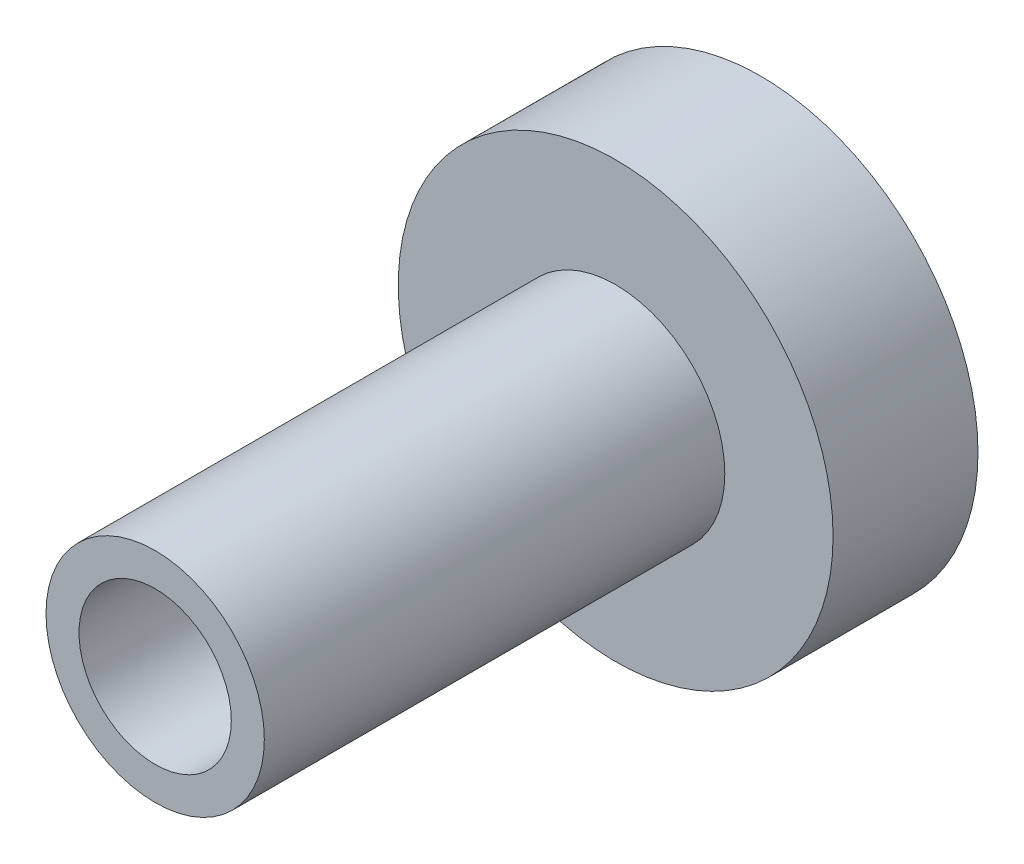
ISO-10303-21;
HEADER;
FILE_DESCRIPTION(('STEP AP214'),'2;1');
FILE_NAME('part.step','',(''),(''),'','','');
FILE_SCHEMA(('AUTOMOTIVE_DESIGN { 1 0 10303 214 1 1 1 1 }'));
ENDSEC;
DATA;
#1=APPLICATION_CONTEXT('core data for automotive mechanical design processes');
#2=APPLICATION_PROTOCOL_DEFINITION('international standard','automotive_design',2000,#1);
#3=PRODUCT_CONTEXT('',#1,'mechanical');
#4=PRODUCT('Part','Part','',(#3));
#5=PRODUCT_RELATED_PRODUCT_CATEGORY('part','',(#4));
#6=PRODUCT_DEFINITION_FORMATION('','',#4);
#7=PRODUCT_DEFINITION_CONTEXT('part definition',#1,'design');
#8=PRODUCT_DEFINITION('design','',#6,#7);
#9=PRODUCT_DEFINITION_SHAPE('','',#8);
#10=(LENGTH_UNIT() NAMED_UNIT(*) SI_UNIT(.MILLI.,.METRE.));
#11=(NAMED_UNIT(*) PLANE_ANGLE_UNIT() SI_UNIT($,.RADIAN.));
#12=(NAMED_UNIT(*) SI_UNIT($,.STERADIAN.) SOLID_ANGLE_UNIT());
#13=UNCERTAINTY_MEASURE_WITH_UNIT(LENGTH_MEASURE(1.E-05),#10,'distance_accuracy_value','');
#14=(GEOMETRIC_REPRESENTATION_CONTEXT(3) GLOBAL_UNCERTAINTY_ASSIGNED_CONTEXT((#13)) GLOBAL_UNIT_ASSIGNED_CONTEXT((#10,
#11,#12)) REPRESENTATION_CONTEXT('',''));
#15=CARTESIAN_POINT('',(0.,0.,0.));
#16=DIRECTION('',(0.,0.,1.));
#17=DIRECTION('',(1.,0.,0.));
#18=AXIS2_PLACEMENT_3D('',#15,#16,#17);
#19=CARTESIAN_POINT('',(0.,0.,33.));
#20=DIRECTION('',(0.,0.,1.));
#21=DIRECTION('',(1.,0.,0.));
#22=AXIS2_PLACEMENT_3D('',#19,#20,#21);
#23=PLANE('',#22);
#24=CARTESIAN_POINT('',(0.,0.,33.));
#25=DIRECTION('',(0.,0.,1.));
#26=DIRECTION('',(1.,0.,0.));
#27=AXIS2_PLACEMENT_3D('',#24,#25,#26);
#28=CIRCLE('',#27,4.15);
#29=CARTESIAN_POINT('',(4.15,0.,33.));
#30=VERTEX_POINT('',#29);
#31=EDGE_CURVE('E38',#30,#30,#28,.T.);
#32=ORIENTED_EDGE('',*,*,#31,.F.);
#33=EDGE_LOOP('',(#32));
#34=FACE_BOUND('',#33,.T.);
#35=CARTESIAN_POINT('',(0.,0.,33.));
#36=DIRECTION('',(0.,0.,1.));
#37=DIRECTION('',(1.,0.,0.));
#38=AXIS2_PLACEMENT_3D('',#35,#36,#37);
#39=CIRCLE('',#38,5.95);
#40=CARTESIAN_POINT('',(5.95,0.,33.));
#41=VERTEX_POINT('',#40);
#42=EDGE_CURVE('E52',#41,#41,#39,.T.);
#43=ORIENTED_EDGE('',*,*,#42,.T.);
#44=EDGE_LOOP('',(#43));
#45=FACE_BOUND('',#44,.T.);
#46=ADVANCED_FACE('F31',(#34,#45),#23,.T.);
#47=CARTESIAN_POINT('',(0.,0.,33.));
#48=DIRECTION('',(0.,0.,-1.));
#49=DIRECTION('',(-1.,0.,0.));
#50=AXIS2_PLACEMENT_3D('',#47,#48,#49);
#51=CYLINDRICAL_SURFACE('',#50,11.85);
#52=CARTESIAN_POINT('',(0.,0.,0.));
#53=DIRECTION('',(0.,0.,1.));
#54=DIRECTION('',(1.,0.,0.));
#55=AXIS2_PLACEMENT_3D('',#52,#53,#54);
#56=CIRCLE('',#55,11.85);
#57=CARTESIAN_POINT('',(11.85,0.,0.));
#58=VERTEX_POINT('',#57);
#59=EDGE_CURVE('E10',#58,#58,#56,.T.);
#60=ORIENTED_EDGE('',*,*,#59,.T.);
#61=EDGE_LOOP('',(#60));
#62=FACE_BOUND('',#61,.T.);
#63=CARTESIAN_POINT('',(0.,0.,7.9));
#64=DIRECTION('',(0.,0.,1.));
#65=DIRECTION('',(1.,0.,0.));
#66=AXIS2_PLACEMENT_3D('',#63,#64,#65);
#67=CIRCLE('',#66,11.85);
#68=CARTESIAN_POINT('',(11.85,0.,7.9));
#69=VERTEX_POINT('',#68);
#70=EDGE_CURVE('E47',#69,#69,#67,.T.);
#71=ORIENTED_EDGE('',*,*,#70,.F.);
#72=EDGE_LOOP('',(#71));
#73=FACE_BOUND('',#72,.T.);
#74=ADVANCED_FACE('F33',(#62,#73),#51,.T.);
#75=CARTESIAN_POINT('',(0.,0.,0.));
#76=DIRECTION('',(0.,0.,1.));
#77=DIRECTION('',(1.,0.,0.));
#78=AXIS2_PLACEMENT_3D('',#75,#76,#77);
#79=PLANE('',#78);
#80=ORIENTED_EDGE('',*,*,#59,.F.);
#81=EDGE_LOOP('',(#80));
#82=FACE_BOUND('',#81,.T.);
#83=CARTESIAN_POINT('',(0.,0.,0.));
#84=DIRECTION('',(0.,0.,1.));
#85=DIRECTION('',(1.,0.,0.));
#86=AXIS2_PLACEMENT_3D('',#83,#84,#85);
#87=CIRCLE('',#86,4.15);
#88=CARTESIAN_POINT('',(4.15,0.,0.));
#89=VERTEX_POINT('',#88);
#90=EDGE_CURVE('E42',#89,#89,#87,.T.);
#91=ORIENTED_EDGE('',*,*,#90,.T.);
#92=EDGE_LOOP('',(#91));
#93=FACE_BOUND('',#92,.T.);
#94=ADVANCED_FACE('F69',(#82,#93),#79,.F.);
#95=CARTESIAN_POINT('',(0.,0.,33.));
#96=DIRECTION('',(0.,0.,-1.));
#97=DIRECTION('',(-1.,0.,0.));
#98=AXIS2_PLACEMENT_3D('',#95,#96,#97);
#99=CYLINDRICAL_SURFACE('',#98,4.15);
#100=ORIENTED_EDGE('',*,*,#31,.T.);
#101=EDGE_LOOP('',(#100));
#102=FACE_BOUND('',#101,.T.);
#103=ORIENTED_EDGE('',*,*,#90,.F.);
#104=EDGE_LOOP('',(#103));
#105=FACE_BOUND('',#104,.T.);
#106=ADVANCED_FACE('F64',(#102,#105),#99,.F.);
#107=CARTESIAN_POINT('',(0.,0.,7.9));
#108=DIRECTION('',(0.,0.,1.));
#109=DIRECTION('',(1.,0.,0.));
#110=AXIS2_PLACEMENT_3D('',#107,#108,#109);
#111=PLANE('',#110);
#112=CARTESIAN_POINT('',(0.,0.,7.9));
#113=DIRECTION('',(0.,0.,1.));
#114=DIRECTION('',(1.,0.,0.));
#115=AXIS2_PLACEMENT_3D('',#112,#113,#114);
#116=CIRCLE('',#115,5.95);
#117=CARTESIAN_POINT('',(5.95,0.,7.9));
#118=VERTEX_POINT('',#117);
#119=EDGE_CURVE('E51',#118,#118,#116,.T.);
#120=ORIENTED_EDGE('',*,*,#119,.F.);
#121=EDGE_LOOP('',(#120));
#122=FACE_BOUND('',#121,.T.);
#123=ORIENTED_EDGE('',*,*,#70,.T.);
#124=EDGE_LOOP('',(#123));
#125=FACE_BOUND('',#124,.T.);
#126=ADVANCED_FACE('F61',(#122,#125),#111,.T.);
#127=CARTESIAN_POINT('',(0.,0.,7.9));
#128=DIRECTION('',(0.,0.,1.));
#129=DIRECTION('',(1.,0.,0.));
#130=AXIS2_PLACEMENT_3D('',#127,#128,#129);
#131=CYLINDRICAL_SURFACE('',#130,5.95);
#132=ORIENTED_EDGE('',*,*,#119,.T.);
#133=EDGE_LOOP('',(#132));
#134=FACE_BOUND('',#133,.T.);
#135=ORIENTED_EDGE('',*,*,#42,.F.);
#136=EDGE_LOOP('',(#135));
#137=FACE_BOUND('',#136,.T.);
#138=ADVANCED_FACE('F58',(#134,#137),#131,.T.);
#139=CLOSED_SHELL('',(#46,#74,#94,#106,#126,#138));
#140=MANIFOLD_SOLID_BREP('B2',#139);
#141=ADVANCED_BREP_SHAPE_REPRESENTATION('',(#18,#140),#14);
#142=SHAPE_DEFINITION_REPRESENTATION(#9,#141);
ENDSEC;
END-ISO-10303-21;
